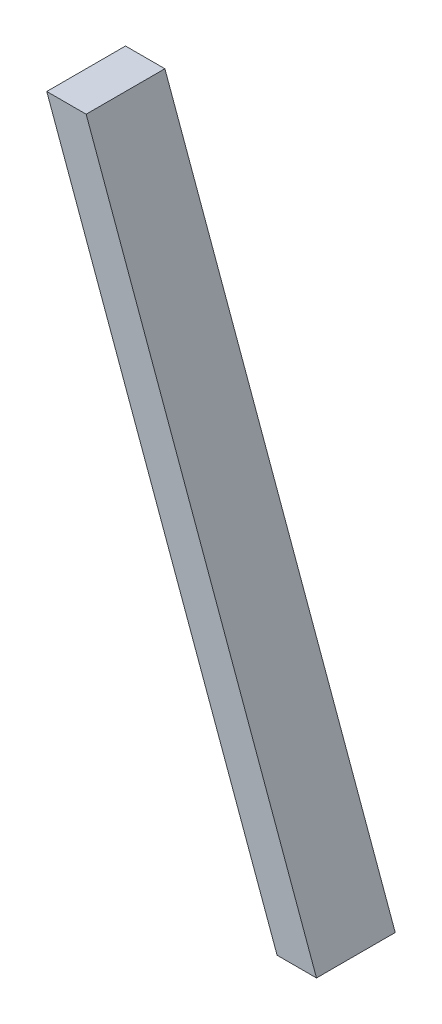
ISO-10303-21;
HEADER;
FILE_DESCRIPTION(('STEP AP214'),'2;1');
FILE_NAME('part.step','',(''),(''),'','','');
FILE_SCHEMA(('AUTOMOTIVE_DESIGN { 1 0 10303 214 1 1 1 1 }'));
ENDSEC;
DATA;
#1=APPLICATION_CONTEXT('core data for automotive mechanical design processes');
#2=APPLICATION_PROTOCOL_DEFINITION('international standard','automotive_design',2000,#1);
#3=PRODUCT_CONTEXT('',#1,'mechanical');
#4=PRODUCT('Part','Part','',(#3));
#5=PRODUCT_RELATED_PRODUCT_CATEGORY('part','',(#4));
#6=PRODUCT_DEFINITION_FORMATION('','',#4);
#7=PRODUCT_DEFINITION_CONTEXT('part definition',#1,'design');
#8=PRODUCT_DEFINITION('design','',#6,#7);
#9=PRODUCT_DEFINITION_SHAPE('','',#8);
#10=(LENGTH_UNIT() NAMED_UNIT(*) SI_UNIT(.MILLI.,.METRE.));
#11=(NAMED_UNIT(*) PLANE_ANGLE_UNIT() SI_UNIT($,.RADIAN.));
#12=(NAMED_UNIT(*) SI_UNIT($,.STERADIAN.) SOLID_ANGLE_UNIT());
#13=UNCERTAINTY_MEASURE_WITH_UNIT(LENGTH_MEASURE(1.E-05),#10,'distance_accuracy_value','');
#14=(GEOMETRIC_REPRESENTATION_CONTEXT(3) GLOBAL_UNCERTAINTY_ASSIGNED_CONTEXT((#13)) GLOBAL_UNIT_ASSIGNED_CONTEXT((#10,
#11,#12)) REPRESENTATION_CONTEXT('',''));
#15=CARTESIAN_POINT('',(0.,0.,0.));
#16=DIRECTION('',(0.,0.,1.));
#17=DIRECTION('',(1.,0.,0.));
#18=AXIS2_PLACEMENT_3D('',#15,#16,#17);
#19=CARTESIAN_POINT('',(2654.91784841709,4015.,-49.999999999997));
#20=DIRECTION('',(0.,-1.,0.));
#21=DIRECTION('',(0.,0.,-1.));
#22=AXIS2_PLACEMENT_3D('',#19,#20,#21);
#23=PLANE('',#22);
#24=DIRECTION('',(0.,0.,-1.));
#25=VECTOR('',#24,1.);
#26=CARTESIAN_POINT('',(2554.91784841709,4015.,-49.9999999999969));
#27=LINE('',#26,#25);
#28=CARTESIAN_POINT('',(2554.91784841709,4015.,150.000000000003));
#29=VERTEX_POINT('',#28);
#30=CARTESIAN_POINT('',(2554.91784841709,4015.,-49.999999999997));
#31=VERTEX_POINT('',#30);
#32=EDGE_CURVE('E88',#29,#31,#27,.T.);
#33=ORIENTED_EDGE('',*,*,#32,.F.);
#34=DIRECTION('',(-1.,0.,0.));
#35=VECTOR('',#34,1.);
#36=CARTESIAN_POINT('',(160.,4015.,150.));
#37=LINE('',#36,#35);
#38=CARTESIAN_POINT('',(2654.91784841709,4015.,150.000000000003));
#39=VERTEX_POINT('',#38);
#40=EDGE_CURVE('E41',#39,#29,#37,.T.);
#41=ORIENTED_EDGE('',*,*,#40,.F.);
#42=DIRECTION('',(0.,0.,1.));
#43=VECTOR('',#42,1.);
#44=CARTESIAN_POINT('',(2654.91784841709,4015.,-49.999999999997));
#45=LINE('',#44,#43);
#46=CARTESIAN_POINT('',(2654.91784841709,4015.,-49.999999999997));
#47=VERTEX_POINT('',#46);
#48=EDGE_CURVE('E80',#47,#39,#45,.T.);
#49=ORIENTED_EDGE('',*,*,#48,.F.);
#50=DIRECTION('',(1.,0.,0.));
#51=VECTOR('',#50,1.);
#52=CARTESIAN_POINT('',(3600.5551275464,4015.,-49.9999999999967));
#53=LINE('',#52,#51);
#54=EDGE_CURVE('E11',#31,#47,#53,.T.);
#55=ORIENTED_EDGE('',*,*,#54,.F.);
#56=EDGE_LOOP('',(#33,#41,#49,#55));
#57=FACE_BOUND('',#56,.T.);
#58=ADVANCED_FACE('F34',(#57),#23,.F.);
#59=CARTESIAN_POINT('',(1410.,2407.5,150.000000000003));
#60=DIRECTION('',(0.,1.,0.));
#61=DIRECTION('',(0.,0.,1.));
#62=AXIS2_PLACEMENT_3D('',#59,#60,#61);
#63=PLANE('',#62);
#64=DIRECTION('',(-1.,0.,0.));
#65=VECTOR('',#64,1.);
#66=CARTESIAN_POINT('',(3600.5551275464,2407.5,-49.999999999997));
#67=LINE('',#66,#65);
#68=CARTESIAN_POINT('',(3240.,2407.5,-49.999999999997));
#69=VERTEX_POINT('',#68);
#70=CARTESIAN_POINT('',(3140.,2407.5,-49.999999999997));
#71=VERTEX_POINT('',#70);
#72=EDGE_CURVE('E95',#69,#71,#67,.T.);
#73=ORIENTED_EDGE('',*,*,#72,.F.);
#74=DIRECTION('',(0.,0.,1.));
#75=VECTOR('',#74,1.);
#76=CARTESIAN_POINT('',(3240.,2407.5,150.000000000003));
#77=LINE('',#76,#75);
#78=CARTESIAN_POINT('',(3240.,2407.5,150.000000000003));
#79=VERTEX_POINT('',#78);
#80=EDGE_CURVE('E84',#69,#79,#77,.T.);
#81=ORIENTED_EDGE('',*,*,#80,.T.);
#82=DIRECTION('',(1.,0.,0.));
#83=VECTOR('',#82,1.);
#84=CARTESIAN_POINT('',(160.,2407.5,150.));
#85=LINE('',#84,#83);
#86=CARTESIAN_POINT('',(3140.,2407.5,150.000000000003));
#87=VERTEX_POINT('',#86);
#88=EDGE_CURVE('E97',#87,#79,#85,.T.);
#89=ORIENTED_EDGE('',*,*,#88,.F.);
#90=DIRECTION('',(0.,0.,1.));
#91=VECTOR('',#90,1.);
#92=CARTESIAN_POINT('',(3140.,2407.5,-49.9999999999969));
#93=LINE('',#92,#91);
#94=EDGE_CURVE('E86',#71,#87,#93,.T.);
#95=ORIENTED_EDGE('',*,*,#94,.F.);
#96=EDGE_LOOP('',(#73,#81,#89,#95));
#97=FACE_BOUND('',#96,.T.);
#98=ADVANCED_FACE('F108',(#97),#63,.F.);
#99=CARTESIAN_POINT('',(3140.,2407.5,-49.9999999999969));
#100=DIRECTION('',(-0.93969262078591,-0.342020143325663,0.));
#101=DIRECTION('',(0.342020143325663,-0.939692620785911,0.));
#102=AXIS2_PLACEMENT_3D('',#99,#100,#101);
#103=PLANE('',#102);
#104=DIRECTION('',(-0.342020143325663,0.939692620785911,0.));
#105=VECTOR('',#104,1.);
#106=CARTESIAN_POINT('',(3140.,2407.5,150.000000000003));
#107=LINE('',#106,#105);
#108=EDGE_CURVE('E90',#87,#29,#107,.T.);
#109=ORIENTED_EDGE('',*,*,#108,.T.);
#110=ORIENTED_EDGE('',*,*,#32,.T.);
#111=DIRECTION('',(-0.342020143325663,0.939692620785911,0.));
#112=VECTOR('',#111,1.);
#113=CARTESIAN_POINT('',(3140.,2407.5,-49.9999999999969));
#114=LINE('',#113,#112);
#115=EDGE_CURVE('E75',#71,#31,#114,.T.);
#116=ORIENTED_EDGE('',*,*,#115,.F.);
#117=ORIENTED_EDGE('',*,*,#94,.T.);
#118=EDGE_LOOP('',(#109,#110,#116,#117));
#119=FACE_BOUND('',#118,.T.);
#120=ADVANCED_FACE('F104',(#119),#103,.T.);
#121=CARTESIAN_POINT('',(3240.,2407.5,-49.999999999997));
#122=DIRECTION('',(0.93969262078591,0.342020143325663,0.));
#123=DIRECTION('',(-0.342020143325663,0.939692620785911,0.));
#124=AXIS2_PLACEMENT_3D('',#121,#122,#123);
#125=PLANE('',#124);
#126=DIRECTION('',(-0.342020143325663,0.939692620785911,0.));
#127=VECTOR('',#126,1.);
#128=CARTESIAN_POINT('',(3240.,2407.5,150.000000000003));
#129=LINE('',#128,#127);
#130=EDGE_CURVE('E48',#79,#39,#129,.T.);
#131=ORIENTED_EDGE('',*,*,#130,.F.);
#132=ORIENTED_EDGE('',*,*,#80,.F.);
#133=DIRECTION('',(-0.342020143325663,0.939692620785911,0.));
#134=VECTOR('',#133,1.);
#135=CARTESIAN_POINT('',(3240.,2407.5,-49.999999999997));
#136=LINE('',#135,#134);
#137=EDGE_CURVE('E55',#69,#47,#136,.T.);
#138=ORIENTED_EDGE('',*,*,#137,.T.);
#139=ORIENTED_EDGE('',*,*,#48,.T.);
#140=EDGE_LOOP('',(#131,#132,#138,#139));
#141=FACE_BOUND('',#140,.T.);
#142=ADVANCED_FACE('F82',(#141),#125,.T.);
#143=CARTESIAN_POINT('',(160.,2347.5,150.));
#144=DIRECTION('',(0.,0.,-1.));
#145=DIRECTION('',(-1.,0.,0.));
#146=AXIS2_PLACEMENT_3D('',#143,#144,#145);
#147=PLANE('',#146);
#148=ORIENTED_EDGE('',*,*,#130,.T.);
#149=ORIENTED_EDGE('',*,*,#40,.T.);
#150=ORIENTED_EDGE('',*,*,#108,.F.);
#151=ORIENTED_EDGE('',*,*,#88,.T.);
#152=EDGE_LOOP('',(#148,#149,#150,#151));
#153=FACE_BOUND('',#152,.T.);
#154=ADVANCED_FACE('F101',(#153),#147,.F.);
#155=CARTESIAN_POINT('',(3600.5551275464,2107.5,-49.999999999997));
#156=DIRECTION('',(0.,0.,1.));
#157=DIRECTION('',(0.,-1.,0.));
#158=AXIS2_PLACEMENT_3D('',#155,#156,#157);
#159=PLANE('',#158);
#160=ORIENTED_EDGE('',*,*,#115,.T.);
#161=ORIENTED_EDGE('',*,*,#54,.T.);
#162=ORIENTED_EDGE('',*,*,#137,.F.);
#163=ORIENTED_EDGE('',*,*,#72,.T.);
#164=EDGE_LOOP('',(#160,#161,#162,#163));
#165=FACE_BOUND('',#164,.T.);
#166=ADVANCED_FACE('F73',(#165),#159,.F.);
#167=CLOSED_SHELL('',(#58,#98,#120,#142,#154,#166));
#168=MANIFOLD_SOLID_BREP('B2',#167);
#169=ADVANCED_BREP_SHAPE_REPRESENTATION('',(#18,#168),#14);
#170=SHAPE_DEFINITION_REPRESENTATION(#9,#169);
ENDSEC;
END-ISO-10303-21;
